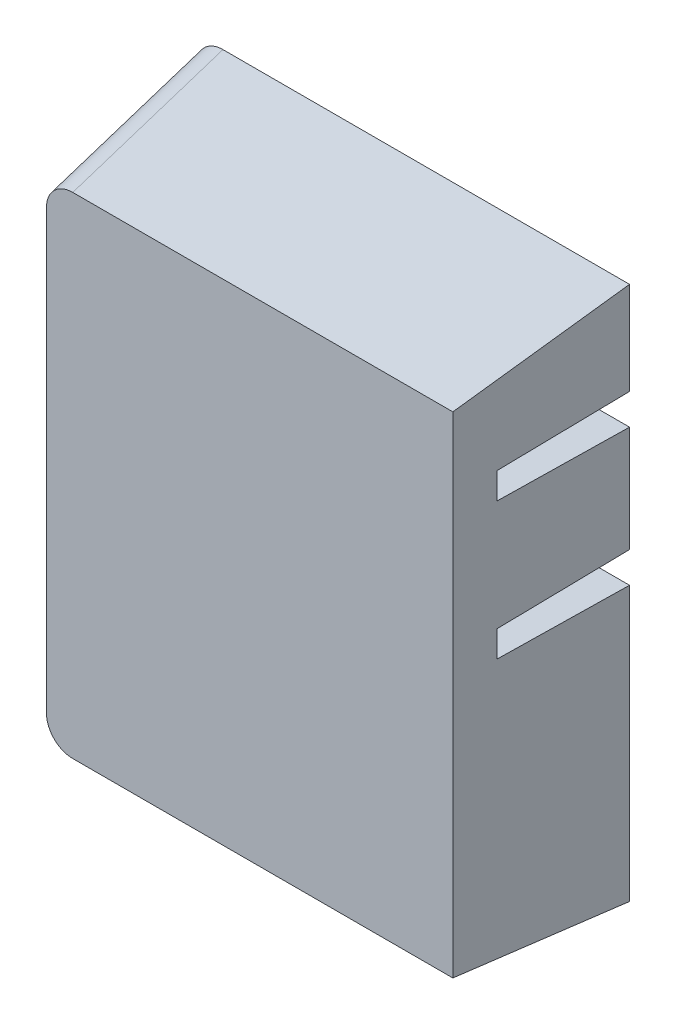
ISO-10303-21;
HEADER;
FILE_DESCRIPTION(('STEP AP214'),'2;1');
FILE_NAME('part.step','',(''),(''),'','','');
FILE_SCHEMA(('AUTOMOTIVE_DESIGN { 1 0 10303 214 1 1 1 1 }'));
ENDSEC;
DATA;
#1=APPLICATION_CONTEXT('core data for automotive mechanical design processes');
#2=APPLICATION_PROTOCOL_DEFINITION('international standard','automotive_design',2000,#1);
#3=PRODUCT_CONTEXT('',#1,'mechanical');
#4=PRODUCT('Part','Part','',(#3));
#5=PRODUCT_RELATED_PRODUCT_CATEGORY('part','',(#4));
#6=PRODUCT_DEFINITION_FORMATION('','',#4);
#7=PRODUCT_DEFINITION_CONTEXT('part definition',#1,'design');
#8=PRODUCT_DEFINITION('design','',#6,#7);
#9=PRODUCT_DEFINITION_SHAPE('','',#8);
#10=(LENGTH_UNIT() NAMED_UNIT(*) SI_UNIT(.MILLI.,.METRE.));
#11=(NAMED_UNIT(*) PLANE_ANGLE_UNIT() SI_UNIT($,.RADIAN.));
#12=(NAMED_UNIT(*) SI_UNIT($,.STERADIAN.) SOLID_ANGLE_UNIT());
#13=UNCERTAINTY_MEASURE_WITH_UNIT(LENGTH_MEASURE(1.E-05),#10,'distance_accuracy_value','');
#14=(GEOMETRIC_REPRESENTATION_CONTEXT(3) GLOBAL_UNCERTAINTY_ASSIGNED_CONTEXT((#13)) GLOBAL_UNIT_ASSIGNED_CONTEXT((#10,
#11,#12)) REPRESENTATION_CONTEXT('',''));
#15=CARTESIAN_POINT('',(0.,0.,0.));
#16=DIRECTION('',(0.,0.,1.));
#17=DIRECTION('',(1.,0.,0.));
#18=AXIS2_PLACEMENT_3D('',#15,#16,#17);
#19=CARTESIAN_POINT('',(0.,0.,-20.));
#20=DIRECTION('',(0.,0.,1.));
#21=DIRECTION('',(1.,0.,0.));
#22=AXIS2_PLACEMENT_3D('',#19,#20,#21);
#23=PLANE('',#22);
#24=DIRECTION('',(0.,-1.,0.));
#25=VECTOR('',#24,1.);
#26=CARTESIAN_POINT('',(-26.,30.25,-20.));
#27=LINE('',#26,#25);
#28=CARTESIAN_POINT('',(-26.,27.2822810142369,-20.));
#29=VERTEX_POINT('',#28);
#30=CARTESIAN_POINT('',(-26.,19.75,-20.));
#31=VERTEX_POINT('',#30);
#32=EDGE_CURVE('E408',#29,#31,#27,.T.);
#33=ORIENTED_EDGE('',*,*,#32,.F.);
#34=CARTESIAN_POINT('',(-22.9664377375765,27.2266533443881,-20.));
#35=DIRECTION('',(0.,0.,1.));
#36=DIRECTION('',(-0.768221279597376,0.64018439966448,0.));
#37=AXIS2_PLACEMENT_3D('',#34,#35,#36);
#38=ELLIPSE('',#37,3.05665258084722,3.);
#39=CARTESIAN_POINT('',(-23.0222533681416,30.25,-20.));
#40=VERTEX_POINT('',#39);
#41=EDGE_CURVE('E475',#29,#40,#38,.F.);
#42=ORIENTED_EDGE('',*,*,#41,.T.);
#43=DIRECTION('',(-1.,0.,0.));
#44=VECTOR('',#43,1.);
#45=CARTESIAN_POINT('',(-26.,30.25,-20.));
#46=LINE('',#45,#44);
#47=CARTESIAN_POINT('',(23.,30.25,-20.));
#48=VERTEX_POINT('',#47);
#49=EDGE_CURVE('E411',#48,#40,#46,.T.);
#50=ORIENTED_EDGE('',*,*,#49,.F.);
#51=DIRECTION('',(0.,1.,0.));
#52=VECTOR('',#51,1.);
#53=CARTESIAN_POINT('',(23.,30.25,-20.));
#54=LINE('',#53,#52);
#55=CARTESIAN_POINT('',(23.,19.75,-20.));
#56=VERTEX_POINT('',#55);
#57=EDGE_CURVE('E539',#56,#48,#54,.T.);
#58=ORIENTED_EDGE('',*,*,#57,.F.);
#59=DIRECTION('',(-1.,0.,0.));
#60=VECTOR('',#59,1.);
#61=CARTESIAN_POINT('',(-32.750772335141,19.75,-20.));
#62=LINE('',#61,#60);
#63=EDGE_CURVE('E231',#56,#31,#62,.T.);
#64=ORIENTED_EDGE('',*,*,#63,.T.);
#65=EDGE_LOOP('',(#33,#42,#50,#58,#64));
#66=FACE_BOUND('',#65,.T.);
#67=ADVANCED_FACE('F42',(#66),#23,.F.);
#68=DIRECTION('',(1.,0.,0.));
#69=VECTOR('',#68,1.);
#70=CARTESIAN_POINT('',(-32.750772335141,16.25,-20.));
#71=LINE('',#70,#69);
#72=CARTESIAN_POINT('',(-26.,16.25,-20.));
#73=VERTEX_POINT('',#72);
#74=CARTESIAN_POINT('',(23.,16.25,-20.));
#75=VERTEX_POINT('',#74);
#76=EDGE_CURVE('E236',#73,#75,#71,.T.);
#77=ORIENTED_EDGE('',*,*,#76,.T.);
#78=CARTESIAN_POINT('',(23.,4.25,-20.));
#79=VERTEX_POINT('',#78);
#80=EDGE_CURVE('E348',#79,#75,#54,.T.);
#81=ORIENTED_EDGE('',*,*,#80,.F.);
#82=DIRECTION('',(-1.,0.,0.));
#83=VECTOR('',#82,1.);
#84=CARTESIAN_POINT('',(-31.1431850369107,4.25,-20.));
#85=LINE('',#84,#83);
#86=CARTESIAN_POINT('',(-26.,4.25,-20.));
#87=VERTEX_POINT('',#86);
#88=EDGE_CURVE('E190',#79,#87,#85,.T.);
#89=ORIENTED_EDGE('',*,*,#88,.T.);
#90=EDGE_CURVE('E412',#73,#87,#27,.T.);
#91=ORIENTED_EDGE('',*,*,#90,.F.);
#92=EDGE_LOOP('',(#77,#81,#89,#91));
#93=FACE_BOUND('',#92,.T.);
#94=ADVANCED_FACE('F372',(#93),#23,.F.);
#95=DIRECTION('',(0.,1.,0.));
#96=VECTOR('',#95,1.);
#97=CARTESIAN_POINT('',(21.,-17.45,-20.));
#98=LINE('',#97,#96);
#99=CARTESIAN_POINT('',(21.,-17.45,-20.));
#100=VERTEX_POINT('',#99);
#101=CARTESIAN_POINT('',(21.,-14.25,-20.));
#102=VERTEX_POINT('',#101);
#103=EDGE_CURVE('E181',#100,#102,#98,.T.);
#104=ORIENTED_EDGE('',*,*,#103,.T.);
#105=DIRECTION('',(-1.,0.,0.));
#106=VECTOR('',#105,1.);
#107=CARTESIAN_POINT('',(-21.,-14.25,-20.));
#108=LINE('',#107,#106);
#109=CARTESIAN_POINT('',(-21.,-14.25,-20.));
#110=VERTEX_POINT('',#109);
#111=EDGE_CURVE('E170',#102,#110,#108,.T.);
#112=ORIENTED_EDGE('',*,*,#111,.T.);
#113=DIRECTION('',(0.,-1.,0.));
#114=VECTOR('',#113,1.);
#115=CARTESIAN_POINT('',(-21.,-17.45,-20.));
#116=LINE('',#115,#114);
#117=CARTESIAN_POINT('',(-21.,-17.45,-20.));
#118=VERTEX_POINT('',#117);
#119=EDGE_CURVE('E180',#110,#118,#116,.T.);
#120=ORIENTED_EDGE('',*,*,#119,.T.);
#121=DIRECTION('',(1.,0.,0.));
#122=VECTOR('',#121,1.);
#123=CARTESIAN_POINT('',(-21.,-17.45,-20.));
#124=LINE('',#123,#122);
#125=EDGE_CURVE('E196',#118,#100,#124,.T.);
#126=ORIENTED_EDGE('',*,*,#125,.T.);
#127=EDGE_LOOP('',(#104,#112,#120,#126));
#128=FACE_BOUND('',#127,.T.);
#129=DIRECTION('',(1.,0.,0.));
#130=VECTOR('',#129,1.);
#131=CARTESIAN_POINT('',(-26.,-30.25,-20.));
#132=LINE('',#131,#130);
#133=CARTESIAN_POINT('',(-23.0222533681416,-30.25,-20.));
#134=VERTEX_POINT('',#133);
#135=CARTESIAN_POINT('',(23.,-30.25,-20.));
#136=VERTEX_POINT('',#135);
#137=EDGE_CURVE('E400',#134,#136,#132,.T.);
#138=ORIENTED_EDGE('',*,*,#137,.F.);
#139=CARTESIAN_POINT('',(-22.9664377375765,-27.2266533443881,-20.));
#140=DIRECTION('',(0.,0.,1.));
#141=DIRECTION('',(-0.768221279597376,-0.64018439966448,0.));
#142=AXIS2_PLACEMENT_3D('',#139,#140,#141);
#143=ELLIPSE('',#142,3.05665258084722,3.);
#144=CARTESIAN_POINT('',(-26.,-27.2822810142369,-20.));
#145=VERTEX_POINT('',#144);
#146=EDGE_CURVE('E12',#134,#145,#143,.F.);
#147=ORIENTED_EDGE('',*,*,#146,.T.);
#148=CARTESIAN_POINT('',(-26.,0.750000000000004,-20.));
#149=VERTEX_POINT('',#148);
#150=EDGE_CURVE('E425',#149,#145,#27,.T.);
#151=ORIENTED_EDGE('',*,*,#150,.F.);
#152=DIRECTION('',(1.,0.,0.));
#153=VECTOR('',#152,1.);
#154=CARTESIAN_POINT('',(-31.1431850369107,0.750000000000004,-20.));
#155=LINE('',#154,#153);
#156=CARTESIAN_POINT('',(23.,0.750000000000004,-20.));
#157=VERTEX_POINT('',#156);
#158=EDGE_CURVE('E216',#149,#157,#155,.T.);
#159=ORIENTED_EDGE('',*,*,#158,.T.);
#160=EDGE_CURVE('E330',#136,#157,#54,.T.);
#161=ORIENTED_EDGE('',*,*,#160,.F.);
#162=EDGE_LOOP('',(#138,#147,#151,#159,#161));
#163=FACE_BOUND('',#162,.T.);
#164=ADVANCED_FACE('F193',(#128,#163),#23,.F.);
#165=CARTESIAN_POINT('',(23.,0.,0.));
#166=DIRECTION('',(1.,0.,0.));
#167=DIRECTION('',(0.,1.,0.));
#168=AXIS2_PLACEMENT_3D('',#165,#166,#167);
#169=PLANE('',#168);
#170=DIRECTION('',(0.,1.,0.));
#171=VECTOR('',#170,1.);
#172=CARTESIAN_POINT('',(23.,0.,-5.));
#173=LINE('',#172,#171);
#174=CARTESIAN_POINT('',(23.,16.5118259739233,-5.));
#175=VERTEX_POINT('',#174);
#176=CARTESIAN_POINT('',(23.,19.4881740260767,-5.));
#177=VERTEX_POINT('',#176);
#178=EDGE_CURVE('E248',#175,#177,#173,.T.);
#179=ORIENTED_EDGE('',*,*,#178,.T.);
#180=DIRECTION('',(0.,-0.0174524064372836,0.999847695156391));
#181=VECTOR('',#180,1.);
#182=CARTESIAN_POINT('',(23.,19.3949894497886,0.338540800128155));
#183=LINE('',#182,#181);
#184=EDGE_CURVE('E275',#177,#56,#183,.F.);
#185=ORIENTED_EDGE('',*,*,#184,.T.);
#186=ORIENTED_EDGE('',*,*,#57,.T.);
#187=DIRECTION('',(0.,0.124034734589208,-0.992277876713668));
#188=VECTOR('',#187,1.);
#189=CARTESIAN_POINT('',(23.,27.75,0.));
#190=LINE('',#189,#188);
#191=CARTESIAN_POINT('',(23.,27.75,0.));
#192=VERTEX_POINT('',#191);
#193=EDGE_CURVE('E294',#192,#48,#190,.T.);
#194=ORIENTED_EDGE('',*,*,#193,.F.);
#195=DIRECTION('',(0.,1.,0.));
#196=VECTOR('',#195,1.);
#197=CARTESIAN_POINT('',(23.,27.75,0.));
#198=LINE('',#197,#196);
#199=CARTESIAN_POINT('',(23.,-27.75,0.));
#200=VERTEX_POINT('',#199);
#201=EDGE_CURVE('E276',#200,#192,#198,.T.);
#202=ORIENTED_EDGE('',*,*,#201,.F.);
#203=DIRECTION('',(0.,-0.124034734589208,-0.992277876713668));
#204=VECTOR('',#203,1.);
#205=CARTESIAN_POINT('',(23.,-27.75,0.));
#206=LINE('',#205,#204);
#207=EDGE_CURVE('E534',#200,#136,#206,.T.);
#208=ORIENTED_EDGE('',*,*,#207,.T.);
#209=ORIENTED_EDGE('',*,*,#160,.T.);
#210=DIRECTION('',(0.,-0.0174524064372835,-0.999847695156391));
#211=VECTOR('',#210,1.);
#212=CARTESIAN_POINT('',(23.,1.09876652715718,-0.019179041072481));
#213=LINE('',#212,#211);
#214=CARTESIAN_POINT('',(23.,1.01182597392327,-5.));
#215=VERTEX_POINT('',#214);
#216=EDGE_CURVE('E261',#157,#215,#213,.F.);
#217=ORIENTED_EDGE('',*,*,#216,.T.);
#218=DIRECTION('',(0.,1.,0.));
#219=VECTOR('',#218,1.);
#220=CARTESIAN_POINT('',(23.,0.,-5.));
#221=LINE('',#220,#219);
#222=CARTESIAN_POINT('',(23.,3.98817402607674,-5.));
#223=VERTEX_POINT('',#222);
#224=EDGE_CURVE('E256',#215,#223,#221,.T.);
#225=ORIENTED_EDGE('',*,*,#224,.T.);
#226=DIRECTION('',(0.,-0.0174524064372835,0.999847695156391));
#227=VECTOR('',#226,1.);
#228=CARTESIAN_POINT('',(23.,3.89971054039057,0.0680697006837717));
#229=LINE('',#228,#227);
#230=EDGE_CURVE('E264',#223,#79,#229,.F.);
#231=ORIENTED_EDGE('',*,*,#230,.T.);
#232=ORIENTED_EDGE('',*,*,#80,.T.);
#233=DIRECTION('',(0.,-0.0174524064372836,-0.999847695156391));
#234=VECTOR('',#233,1.);
#235=CARTESIAN_POINT('',(23.,16.5940454365552,-0.289650140516864));
#236=LINE('',#235,#234);
#237=EDGE_CURVE('E273',#75,#175,#236,.F.);
#238=ORIENTED_EDGE('',*,*,#237,.T.);
#239=EDGE_LOOP('',(#179,#185,#186,#194,#202,#208,#209,#217,#225,#231,#232,#238));
#240=FACE_BOUND('',#239,.T.);
#241=ADVANCED_FACE('F308',(#240),#169,.T.);
#242=CARTESIAN_POINT('',(-22.4938875305624,0.,3.37408312958435));
#243=DIRECTION('',(-0.988936352868298,0.,0.148340452930245));
#244=DIRECTION('',(0.148340452930245,0.,0.988936352868298));
#245=AXIS2_PLACEMENT_3D('',#242,#243,#244);
#246=PLANE('',#245);
#247=DIRECTION('',(0.,-1.,0.));
#248=VECTOR('',#247,1.);
#249=CARTESIAN_POINT('',(-23.,27.75,0.));
#250=LINE('',#249,#248);
#251=CARTESIAN_POINT('',(-23.,24.7822810142369,0.));
#252=VERTEX_POINT('',#251);
#253=CARTESIAN_POINT('',(-23.,-24.7822810142369,0.));
#254=VERTEX_POINT('',#253);
#255=EDGE_CURVE('E525',#252,#254,#250,.T.);
#256=ORIENTED_EDGE('',*,*,#255,.F.);
#257=DIRECTION('',(-0.147219871443575,0.122683226202979,-0.981465809623833));
#258=VECTOR('',#257,1.);
#259=CARTESIAN_POINT('',(-22.0539022092552,23.9938661886162,6.30731860496531));
#260=LINE('',#259,#258);
#261=EDGE_CURVE('E472',#252,#29,#260,.T.);
#262=ORIENTED_EDGE('',*,*,#261,.T.);
#263=ORIENTED_EDGE('',*,*,#32,.T.);
#264=DIRECTION('',(-0.148318357005493,0.0172593770105163,-0.988789046703289));
#265=VECTOR('',#264,1.);
#266=CARTESIAN_POINT('',(-22.4443742745013,19.3362421473399,3.70417150332475));
#267=LINE('',#266,#265);
#268=CARTESIAN_POINT('',(-23.75,19.4881740260767,-5.));
#269=VERTEX_POINT('',#268);
#270=EDGE_CURVE('E469',#31,#269,#267,.F.);
#271=ORIENTED_EDGE('',*,*,#270,.T.);
#272=DIRECTION('',(0.,-1.,0.));
#273=VECTOR('',#272,1.);
#274=CARTESIAN_POINT('',(-23.75,0.,-5.));
#275=LINE('',#274,#273);
#276=CARTESIAN_POINT('',(-23.75,16.5118259739233,-5.));
#277=VERTEX_POINT('',#276);
#278=EDGE_CURVE('E461',#269,#277,#275,.T.);
#279=ORIENTED_EDGE('',*,*,#278,.T.);
#280=DIRECTION('',(0.148318357005493,0.0172593770105163,0.988789046703289));
#281=VECTOR('',#280,1.);
#282=CARTESIAN_POINT('',(-22.5365300423823,16.6530339532477,3.08979971745159));
#283=LINE('',#282,#281);
#284=EDGE_CURVE('E466',#277,#73,#283,.F.);
#285=ORIENTED_EDGE('',*,*,#284,.T.);
#286=ORIENTED_EDGE('',*,*,#90,.T.);
#287=DIRECTION('',(-0.148318357005493,0.0172593770105163,-0.988789046703289));
#288=VECTOR('',#287,1.);
#289=CARTESIAN_POINT('',(-22.4840524523389,3.84085938180913,3.43965031774047));
#290=LINE('',#289,#288);
#291=CARTESIAN_POINT('',(-23.75,3.98817402607674,-5.));
#292=VERTEX_POINT('',#291);
#293=EDGE_CURVE('E457',#87,#292,#290,.F.);
#294=ORIENTED_EDGE('',*,*,#293,.T.);
#295=DIRECTION('',(0.,-1.,0.));
#296=VECTOR('',#295,1.);
#297=CARTESIAN_POINT('',(-23.75,0.,-5.));
#298=LINE('',#297,#296);
#299=CARTESIAN_POINT('',(-23.75,1.01182597392327,-5.));
#300=VERTEX_POINT('',#299);
#301=EDGE_CURVE('E452',#292,#300,#298,.T.);
#302=ORIENTED_EDGE('',*,*,#301,.T.);
#303=DIRECTION('',(0.148318357005493,0.0172593770105163,0.988789046703289));
#304=VECTOR('',#303,1.);
#305=CARTESIAN_POINT('',(-22.4968518645446,1.15765118771692,3.35432090303586));
#306=LINE('',#305,#304);
#307=EDGE_CURVE('E455',#300,#149,#306,.F.);
#308=ORIENTED_EDGE('',*,*,#307,.T.);
#309=ORIENTED_EDGE('',*,*,#150,.T.);
#310=DIRECTION('',(-0.147219871443575,-0.122683226202979,-0.981465809623833));
#311=VECTOR('',#310,1.);
#312=CARTESIAN_POINT('',(-22.0539022092552,-23.9938661886162,6.30731860496531));
#313=LINE('',#312,#311);
#314=EDGE_CURVE('E471',#145,#254,#313,.F.);
#315=ORIENTED_EDGE('',*,*,#314,.T.);
#316=EDGE_LOOP('',(#256,#262,#263,#271,#279,#285,#286,#294,#302,#308,#309,#315));
#317=FACE_BOUND('',#316,.T.);
#318=ADVANCED_FACE('F373',(#317),#246,.T.);
#319=CARTESIAN_POINT('',(0.,0.,0.));
#320=DIRECTION('',(0.,0.,1.));
#321=DIRECTION('',(1.,0.,0.));
#322=AXIS2_PLACEMENT_3D('',#319,#320,#321);
#323=PLANE('',#322);
#324=DIRECTION('',(-1.,0.,0.));
#325=VECTOR('',#324,1.);
#326=CARTESIAN_POINT('',(-23.,27.75,0.));
#327=LINE('',#326,#325);
#328=CARTESIAN_POINT('',(-20.0222533681416,27.75,0.));
#329=VERTEX_POINT('',#328);
#330=EDGE_CURVE('E288',#192,#329,#327,.T.);
#331=ORIENTED_EDGE('',*,*,#330,.T.);
#332=CARTESIAN_POINT('',(-19.9664377375765,24.7266533443881,0.));
#333=DIRECTION('',(0.,0.,1.));
#334=DIRECTION('',(-0.768221279597376,0.64018439966448,0.));
#335=AXIS2_PLACEMENT_3D('',#332,#333,#334);
#336=ELLIPSE('',#335,3.05665258084722,3.);
#337=EDGE_CURVE('E403',#329,#252,#336,.T.);
#338=ORIENTED_EDGE('',*,*,#337,.T.);
#339=ORIENTED_EDGE('',*,*,#255,.T.);
#340=CARTESIAN_POINT('',(-19.9664377375765,-24.7266533443881,0.));
#341=DIRECTION('',(0.,0.,1.));
#342=DIRECTION('',(-0.768221279597376,-0.64018439966448,0.));
#343=AXIS2_PLACEMENT_3D('',#340,#341,#342);
#344=ELLIPSE('',#343,3.05665258084722,3.);
#345=CARTESIAN_POINT('',(-20.0222533681416,-27.75,0.));
#346=VERTEX_POINT('',#345);
#347=EDGE_CURVE('E66',#254,#346,#344,.T.);
#348=ORIENTED_EDGE('',*,*,#347,.T.);
#349=DIRECTION('',(1.,0.,0.));
#350=VECTOR('',#349,1.);
#351=CARTESIAN_POINT('',(-23.,-27.75,0.));
#352=LINE('',#351,#350);
#353=EDGE_CURVE('E46',#346,#200,#352,.T.);
#354=ORIENTED_EDGE('',*,*,#353,.T.);
#355=ORIENTED_EDGE('',*,*,#201,.T.);
#356=EDGE_LOOP('',(#331,#338,#339,#348,#354,#355));
#357=FACE_BOUND('',#356,.T.);
#358=ADVANCED_FACE('F307',(#357),#323,.T.);
#359=CARTESIAN_POINT('',(0.,27.3230769230769,3.41538461538462));
#360=DIRECTION('',(0.,0.992277876713668,0.124034734589208));
#361=DIRECTION('',(0.,-0.124034734589208,0.992277876713668));
#362=AXIS2_PLACEMENT_3D('',#359,#360,#361);
#363=PLANE('',#362);
#364=ORIENTED_EDGE('',*,*,#49,.T.);
#365=DIRECTION('',(-0.147219871443575,0.122683226202979,-0.981465809623833));
#366=VECTOR('',#365,1.);
#367=CARTESIAN_POINT('',(-19.0870931506503,26.9706998187572,6.2344014499422));
#368=LINE('',#367,#366);
#369=EDGE_CURVE('E484',#40,#329,#368,.F.);
#370=ORIENTED_EDGE('',*,*,#369,.T.);
#371=ORIENTED_EDGE('',*,*,#330,.F.);
#372=ORIENTED_EDGE('',*,*,#193,.T.);
#373=EDGE_LOOP('',(#364,#370,#371,#372));
#374=FACE_BOUND('',#373,.T.);
#375=ADVANCED_FACE('F296',(#374),#363,.T.);
#376=CARTESIAN_POINT('',(0.,-27.3230769230769,3.41538461538461));
#377=DIRECTION('',(0.,-0.992277876713668,0.124034734589208));
#378=DIRECTION('',(0.,-0.124034734589208,-0.992277876713668));
#379=AXIS2_PLACEMENT_3D('',#376,#377,#378);
#380=PLANE('',#379);
#381=ORIENTED_EDGE('',*,*,#353,.F.);
#382=DIRECTION('',(-0.147219871443575,-0.122683226202979,-0.981465809623833));
#383=VECTOR('',#382,1.);
#384=CARTESIAN_POINT('',(-19.0870931506503,-26.9706998187572,6.2344014499422));
#385=LINE('',#384,#383);
#386=EDGE_CURVE('E52',#346,#134,#385,.T.);
#387=ORIENTED_EDGE('',*,*,#386,.T.);
#388=ORIENTED_EDGE('',*,*,#137,.T.);
#389=ORIENTED_EDGE('',*,*,#207,.F.);
#390=EDGE_LOOP('',(#381,#387,#388,#389));
#391=FACE_BOUND('',#390,.T.);
#392=ADVANCED_FACE('F306',(#391),#380,.T.);
#393=CARTESIAN_POINT('',(-31.1431850369107,4.25,-20.));
#394=DIRECTION('',(0.,0.999847695156391,0.0174524064372835));
#395=DIRECTION('',(0.,-0.0174524064372836,0.999847695156391));
#396=AXIS2_PLACEMENT_3D('',#393,#394,#395);
#397=PLANE('',#396);
#398=DIRECTION('',(1.,0.,0.));
#399=VECTOR('',#398,1.);
#400=CARTESIAN_POINT('',(0.,3.98817402607674,-5.));
#401=LINE('',#400,#399);
#402=EDGE_CURVE('E220',#223,#292,#401,.F.);
#403=ORIENTED_EDGE('',*,*,#402,.T.);
#404=ORIENTED_EDGE('',*,*,#293,.F.);
#405=ORIENTED_EDGE('',*,*,#88,.F.);
#406=ORIENTED_EDGE('',*,*,#230,.F.);
#407=EDGE_LOOP('',(#403,#404,#405,#406));
#408=FACE_BOUND('',#407,.T.);
#409=ADVANCED_FACE('F603',(#408),#397,.F.);
#410=CARTESIAN_POINT('',(-31.1431850369107,0.750000000000004,-20.));
#411=DIRECTION('',(0.,-0.999847695156391,0.0174524064372835));
#412=DIRECTION('',(0.,-0.0174524064372836,-0.999847695156391));
#413=AXIS2_PLACEMENT_3D('',#410,#411,#412);
#414=PLANE('',#413);
#415=ORIENTED_EDGE('',*,*,#158,.F.);
#416=ORIENTED_EDGE('',*,*,#307,.F.);
#417=DIRECTION('',(-1.,0.,0.));
#418=VECTOR('',#417,1.);
#419=CARTESIAN_POINT('',(0.,1.01182597392327,-5.));
#420=LINE('',#419,#418);
#421=EDGE_CURVE('E199',#300,#215,#420,.F.);
#422=ORIENTED_EDGE('',*,*,#421,.T.);
#423=ORIENTED_EDGE('',*,*,#216,.F.);
#424=EDGE_LOOP('',(#415,#416,#422,#423));
#425=FACE_BOUND('',#424,.T.);
#426=ADVANCED_FACE('F596',(#425),#414,.F.);
#427=CARTESIAN_POINT('',(0.,0.,-5.));
#428=DIRECTION('',(0.,0.,-1.));
#429=DIRECTION('',(-1.,0.,0.));
#430=AXIS2_PLACEMENT_3D('',#427,#428,#429);
#431=PLANE('',#430);
#432=ORIENTED_EDGE('',*,*,#421,.F.);
#433=ORIENTED_EDGE('',*,*,#301,.F.);
#434=ORIENTED_EDGE('',*,*,#402,.F.);
#435=ORIENTED_EDGE('',*,*,#224,.F.);
#436=EDGE_LOOP('',(#432,#433,#434,#435));
#437=FACE_BOUND('',#436,.T.);
#438=ADVANCED_FACE('F589',(#437),#431,.T.);
#439=CARTESIAN_POINT('',(-32.750772335141,19.75,-20.));
#440=DIRECTION('',(0.,0.999847695156391,0.0174524064372835));
#441=DIRECTION('',(0.,-0.0174524064372835,0.999847695156391));
#442=AXIS2_PLACEMENT_3D('',#439,#440,#441);
#443=PLANE('',#442);
#444=DIRECTION('',(1.,0.,0.));
#445=VECTOR('',#444,1.);
#446=CARTESIAN_POINT('',(0.,19.4881740260767,-5.));
#447=LINE('',#446,#445);
#448=EDGE_CURVE('E242',#177,#269,#447,.F.);
#449=ORIENTED_EDGE('',*,*,#448,.T.);
#450=ORIENTED_EDGE('',*,*,#270,.F.);
#451=ORIENTED_EDGE('',*,*,#63,.F.);
#452=ORIENTED_EDGE('',*,*,#184,.F.);
#453=EDGE_LOOP('',(#449,#450,#451,#452));
#454=FACE_BOUND('',#453,.T.);
#455=ADVANCED_FACE('F582',(#454),#443,.F.);
#456=CARTESIAN_POINT('',(-32.750772335141,16.25,-20.));
#457=DIRECTION('',(0.,-0.999847695156391,0.0174524064372835));
#458=DIRECTION('',(0.,-0.0174524064372835,-0.999847695156391));
#459=AXIS2_PLACEMENT_3D('',#456,#457,#458);
#460=PLANE('',#459);
#461=ORIENTED_EDGE('',*,*,#76,.F.);
#462=ORIENTED_EDGE('',*,*,#284,.F.);
#463=DIRECTION('',(-1.,0.,0.));
#464=VECTOR('',#463,1.);
#465=CARTESIAN_POINT('',(0.,16.5118259739233,-5.));
#466=LINE('',#465,#464);
#467=EDGE_CURVE('E254',#277,#175,#466,.F.);
#468=ORIENTED_EDGE('',*,*,#467,.T.);
#469=ORIENTED_EDGE('',*,*,#237,.F.);
#470=EDGE_LOOP('',(#461,#462,#468,#469));
#471=FACE_BOUND('',#470,.T.);
#472=ADVANCED_FACE('F577',(#471),#460,.F.);
#473=CARTESIAN_POINT('',(0.,0.,-5.));
#474=DIRECTION('',(0.,0.,-1.));
#475=DIRECTION('',(-1.,0.,0.));
#476=AXIS2_PLACEMENT_3D('',#473,#474,#475);
#477=PLANE('',#476);
#478=ORIENTED_EDGE('',*,*,#467,.F.);
#479=ORIENTED_EDGE('',*,*,#278,.F.);
#480=ORIENTED_EDGE('',*,*,#448,.F.);
#481=ORIENTED_EDGE('',*,*,#178,.F.);
#482=EDGE_LOOP('',(#478,#479,#480,#481));
#483=FACE_BOUND('',#482,.T.);
#484=ADVANCED_FACE('F580',(#483),#477,.T.);
#485=CARTESIAN_POINT('',(21.,-17.45,-20.));
#486=DIRECTION('',(0.999847695156391,0.,0.0174524064372835));
#487=DIRECTION('',(0.0174524064372835,0.,-0.999847695156391));
#488=AXIS2_PLACEMENT_3D('',#485,#486,#487);
#489=PLANE('',#488);
#490=ORIENTED_EDGE('',*,*,#103,.F.);
#491=DIRECTION('',(0.0174497491606827,-0.0174497491606827,-0.999695459881888));
#492=VECTOR('',#491,1.);
#493=CARTESIAN_POINT('',(21.,-17.45,-20.));
#494=LINE('',#493,#492);
#495=CARTESIAN_POINT('',(20.7381740260767,-17.1881740260767,-5.));
#496=VERTEX_POINT('',#495);
#497=EDGE_CURVE('E204',#496,#100,#494,.T.);
#498=ORIENTED_EDGE('',*,*,#497,.F.);
#499=DIRECTION('',(0.,-1.,0.));
#500=VECTOR('',#499,1.);
#501=CARTESIAN_POINT('',(20.7381740260767,0.,-5.));
#502=LINE('',#501,#500);
#503=CARTESIAN_POINT('',(20.7381740260767,-14.5118259739233,-5.));
#504=VERTEX_POINT('',#503);
#505=EDGE_CURVE('E189',#496,#504,#502,.F.);
#506=ORIENTED_EDGE('',*,*,#505,.T.);
#507=DIRECTION('',(0.0174497491606827,0.0174497491606827,-0.999695459881888));
#508=VECTOR('',#507,1.);
#509=CARTESIAN_POINT('',(20.9872112626776,-14.2627887373224,-19.2673337294955));
#510=LINE('',#509,#508);
#511=EDGE_CURVE('E173',#504,#102,#510,.T.);
#512=ORIENTED_EDGE('',*,*,#511,.T.);
#513=EDGE_LOOP('',(#490,#498,#506,#512));
#514=FACE_BOUND('',#513,.T.);
#515=ADVANCED_FACE('F185',(#514),#489,.F.);
#516=CARTESIAN_POINT('',(-21.,-14.25,-20.));
#517=DIRECTION('',(0.,0.999847695156391,0.0174524064372835));
#518=DIRECTION('',(0.,-0.0174524064372836,0.999847695156391));
#519=AXIS2_PLACEMENT_3D('',#516,#517,#518);
#520=PLANE('',#519);
#521=ORIENTED_EDGE('',*,*,#111,.F.);
#522=ORIENTED_EDGE('',*,*,#511,.F.);
#523=DIRECTION('',(1.,0.,0.));
#524=VECTOR('',#523,1.);
#525=CARTESIAN_POINT('',(0.,-14.5118259739233,-5.));
#526=LINE('',#525,#524);
#527=CARTESIAN_POINT('',(-20.7381740260767,-14.5118259739233,-5.));
#528=VERTEX_POINT('',#527);
#529=EDGE_CURVE('E211',#504,#528,#526,.F.);
#530=ORIENTED_EDGE('',*,*,#529,.T.);
#531=DIRECTION('',(-0.0174497491606827,0.0174497491606827,-0.999695459881888));
#532=VECTOR('',#531,1.);
#533=CARTESIAN_POINT('',(-20.9990256200135,-14.2509743799865,-19.9441778079616));
#534=LINE('',#533,#532);
#535=EDGE_CURVE('E175',#528,#110,#534,.T.);
#536=ORIENTED_EDGE('',*,*,#535,.T.);
#537=EDGE_LOOP('',(#521,#522,#530,#536));
#538=FACE_BOUND('',#537,.T.);
#539=ADVANCED_FACE('F172',(#538),#520,.F.);
#540=CARTESIAN_POINT('',(-21.,-17.45,-20.));
#541=DIRECTION('',(-0.999847695156391,0.,0.0174524064372835));
#542=DIRECTION('',(0.0174524064372835,0.,0.999847695156391));
#543=AXIS2_PLACEMENT_3D('',#540,#541,#542);
#544=PLANE('',#543);
#545=ORIENTED_EDGE('',*,*,#119,.F.);
#546=ORIENTED_EDGE('',*,*,#535,.F.);
#547=DIRECTION('',(0.,1.,0.));
#548=VECTOR('',#547,1.);
#549=CARTESIAN_POINT('',(-20.7381740260767,0.,-5.));
#550=LINE('',#549,#548);
#551=CARTESIAN_POINT('',(-20.7381740260767,-17.1881740260767,-5.));
#552=VERTEX_POINT('',#551);
#553=EDGE_CURVE('E213',#528,#552,#550,.F.);
#554=ORIENTED_EDGE('',*,*,#553,.T.);
#555=DIRECTION('',(-0.0174497491606827,-0.0174497491606827,-0.999695459881888));
#556=VECTOR('',#555,1.);
#557=CARTESIAN_POINT('',(-21.,-17.45,-20.));
#558=LINE('',#557,#556);
#559=EDGE_CURVE('E206',#552,#118,#558,.T.);
#560=ORIENTED_EDGE('',*,*,#559,.T.);
#561=EDGE_LOOP('',(#545,#546,#554,#560));
#562=FACE_BOUND('',#561,.T.);
#563=ADVANCED_FACE('F614',(#562),#544,.F.);
#564=CARTESIAN_POINT('',(-21.,-17.45,-20.));
#565=DIRECTION('',(0.,-0.999847695156391,0.0174524064372835));
#566=DIRECTION('',(0.,-0.0174524064372836,-0.999847695156391));
#567=AXIS2_PLACEMENT_3D('',#564,#565,#566);
#568=PLANE('',#567);
#569=ORIENTED_EDGE('',*,*,#125,.F.);
#570=ORIENTED_EDGE('',*,*,#559,.F.);
#571=DIRECTION('',(-1.,0.,0.));
#572=VECTOR('',#571,1.);
#573=CARTESIAN_POINT('',(0.,-17.1881740260767,-5.));
#574=LINE('',#573,#572);
#575=EDGE_CURVE('E207',#552,#496,#574,.F.);
#576=ORIENTED_EDGE('',*,*,#575,.T.);
#577=ORIENTED_EDGE('',*,*,#497,.T.);
#578=EDGE_LOOP('',(#569,#570,#576,#577));
#579=FACE_BOUND('',#578,.T.);
#580=ADVANCED_FACE('F609',(#579),#568,.F.);
#581=CARTESIAN_POINT('',(0.,0.,-5.));
#582=DIRECTION('',(0.,0.,-1.));
#583=DIRECTION('',(-1.,0.,0.));
#584=AXIS2_PLACEMENT_3D('',#581,#582,#583);
#585=PLANE('',#584);
#586=ORIENTED_EDGE('',*,*,#505,.F.);
#587=ORIENTED_EDGE('',*,*,#575,.F.);
#588=ORIENTED_EDGE('',*,*,#553,.F.);
#589=ORIENTED_EDGE('',*,*,#529,.F.);
#590=EDGE_LOOP('',(#586,#587,#588,#589));
#591=FACE_BOUND('',#590,.T.);
#592=ADVANCED_FACE('F606',(#591),#585,.T.);
#593=CARTESIAN_POINT('',(-19.0870931506503,23.9938661886162,5.86229724617457));
#594=DIRECTION('',(-0.147219871443575,0.122683226202979,-0.981465809623833));
#595=DIRECTION('',(-0.988936352868298,0.,0.148340452930245));
#596=AXIS2_PLACEMENT_3D('',#593,#594,#595);
#597=CYLINDRICAL_SURFACE('',#596,3.);
#598=ORIENTED_EDGE('',*,*,#337,.F.);
#599=ORIENTED_EDGE('',*,*,#369,.F.);
#600=ORIENTED_EDGE('',*,*,#41,.F.);
#601=ORIENTED_EDGE('',*,*,#261,.F.);
#602=EDGE_LOOP('',(#598,#599,#600,#601));
#603=FACE_BOUND('',#602,.T.);
#604=ADVANCED_FACE('F375',(#603),#597,.T.);
#605=CARTESIAN_POINT('',(-19.0870931506503,-23.9938661886162,5.86229724617457));
#606=DIRECTION('',(-0.147219871443575,-0.122683226202979,-0.981465809623833));
#607=DIRECTION('',(-0.988936352868298,0.,0.148340452930245));
#608=AXIS2_PLACEMENT_3D('',#605,#606,#607);
#609=CYLINDRICAL_SURFACE('',#608,3.);
#610=ORIENTED_EDGE('',*,*,#347,.F.);
#611=ORIENTED_EDGE('',*,*,#314,.F.);
#612=ORIENTED_EDGE('',*,*,#146,.F.);
#613=ORIENTED_EDGE('',*,*,#386,.F.);
#614=EDGE_LOOP('',(#610,#611,#612,#613));
#615=FACE_BOUND('',#614,.T.);
#616=ADVANCED_FACE('F44',(#615),#609,.T.);
#617=CLOSED_SHELL('',(#67,#94,#164,#241,#318,#358,#375,#392,#409,#426,#438,#455,#472,#484,#515,
#539,#563,#580,#592,#604,#616));
#618=MANIFOLD_SOLID_BREP('B2',#617);
#619=ADVANCED_BREP_SHAPE_REPRESENTATION('',(#18,#618),#14);
#620=SHAPE_DEFINITION_REPRESENTATION(#9,#619);
ENDSEC;
END-ISO-10303-21;
